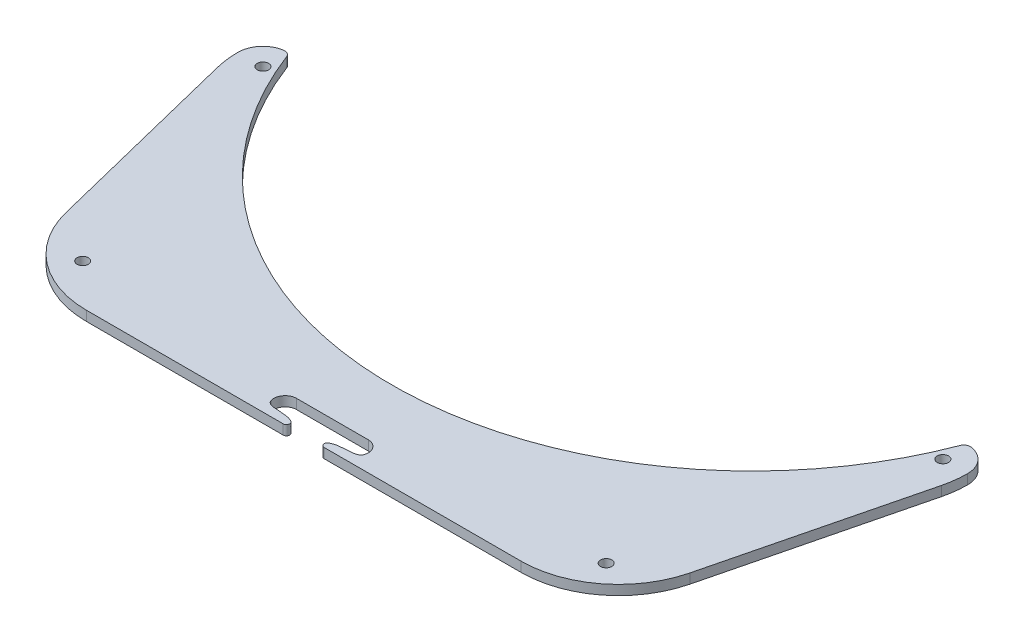
ISO-10303-21;
HEADER;
FILE_DESCRIPTION(('STEP AP214'),'2;1');
FILE_NAME('part.step','',(''),(''),'','','');
FILE_SCHEMA(('AUTOMOTIVE_DESIGN { 1 0 10303 214 1 1 1 1 }'));
ENDSEC;
DATA;
#1=APPLICATION_CONTEXT('core data for automotive mechanical design processes');
#2=APPLICATION_PROTOCOL_DEFINITION('international standard','automotive_design',2000,#1);
#3=PRODUCT_CONTEXT('',#1,'mechanical');
#4=PRODUCT('Part','Part','',(#3));
#5=PRODUCT_RELATED_PRODUCT_CATEGORY('part','',(#4));
#6=PRODUCT_DEFINITION_FORMATION('','',#4);
#7=PRODUCT_DEFINITION_CONTEXT('part definition',#1,'design');
#8=PRODUCT_DEFINITION('design','',#6,#7);
#9=PRODUCT_DEFINITION_SHAPE('','',#8);
#10=(LENGTH_UNIT() NAMED_UNIT(*) SI_UNIT(.MILLI.,.METRE.));
#11=(NAMED_UNIT(*) PLANE_ANGLE_UNIT() SI_UNIT($,.RADIAN.));
#12=(NAMED_UNIT(*) SI_UNIT($,.STERADIAN.) SOLID_ANGLE_UNIT());
#13=UNCERTAINTY_MEASURE_WITH_UNIT(LENGTH_MEASURE(1.E-05),#10,'distance_accuracy_value','');
#14=(GEOMETRIC_REPRESENTATION_CONTEXT(3) GLOBAL_UNCERTAINTY_ASSIGNED_CONTEXT((#13)) GLOBAL_UNIT_ASSIGNED_CONTEXT((#10,
#11,#12)) REPRESENTATION_CONTEXT('',''));
#15=CARTESIAN_POINT('',(0.,0.,0.));
#16=DIRECTION('',(0.,0.,1.));
#17=DIRECTION('',(1.,0.,0.));
#18=AXIS2_PLACEMENT_3D('',#15,#16,#17);
#19=CARTESIAN_POINT('',(0.,3.,29.3456606023015));
#20=DIRECTION('',(0.,0.,-1.));
#21=DIRECTION('',(-1.,0.,0.));
#22=AXIS2_PLACEMENT_3D('',#19,#20,#21);
#23=PLANE('',#22);
#24=DIRECTION('',(0.,1.,0.));
#25=VECTOR('',#24,1.);
#26=CARTESIAN_POINT('',(-6.29344842056771,-7.,29.3456606023015));
#27=LINE('',#26,#25);
#28=CARTESIAN_POINT('',(-6.29344842056771,0.,29.3456606023015));
#29=VERTEX_POINT('',#28);
#30=CARTESIAN_POINT('',(-6.29344842056771,3.,29.3456606023015));
#31=VERTEX_POINT('',#30);
#32=EDGE_CURVE('E52',#29,#31,#27,.T.);
#33=ORIENTED_EDGE('',*,*,#32,.T.);
#34=DIRECTION('',(1.,0.,0.));
#35=VECTOR('',#34,1.);
#36=CARTESIAN_POINT('',(0.,3.,29.3456606023015));
#37=LINE('',#36,#35);
#38=CARTESIAN_POINT('',(-66.7805914104085,3.,29.3456606023015));
#39=VERTEX_POINT('',#38);
#40=EDGE_CURVE('E119',#39,#31,#37,.T.);
#41=ORIENTED_EDGE('',*,*,#40,.F.);
#42=DIRECTION('',(0.,-1.,0.));
#43=VECTOR('',#42,1.);
#44=CARTESIAN_POINT('',(-66.7805914104085,3.,29.3456606023015));
#45=LINE('',#44,#43);
#46=CARTESIAN_POINT('',(-66.7805914104085,0.,29.3456606023015));
#47=VERTEX_POINT('',#46);
#48=EDGE_CURVE('E130',#39,#47,#45,.T.);
#49=ORIENTED_EDGE('',*,*,#48,.T.);
#50=DIRECTION('',(1.,0.,0.));
#51=VECTOR('',#50,1.);
#52=CARTESIAN_POINT('',(0.,0.,29.3456606023015));
#53=LINE('',#52,#51);
#54=EDGE_CURVE('E151',#47,#29,#53,.T.);
#55=ORIENTED_EDGE('',*,*,#54,.T.);
#56=EDGE_LOOP('',(#33,#41,#49,#55));
#57=FACE_BOUND('',#56,.T.);
#58=ADVANCED_FACE('F37',(#57),#23,.F.);
#59=CARTESIAN_POINT('',(0.,3.,0.));
#60=DIRECTION('',(0.,1.,0.));
#61=DIRECTION('',(0.,0.,1.));
#62=AXIS2_PLACEMENT_3D('',#59,#60,#61);
#63=PLANE('',#62);
#64=CARTESIAN_POINT('',(104.507530950677,3.,-62.6241657822366));
#65=DIRECTION('',(0.,1.,0.));
#66=DIRECTION('',(0.,0.,1.));
#67=AXIS2_PLACEMENT_3D('',#64,#65,#66);
#68=CIRCLE('',#67,1.75);
#69=CARTESIAN_POINT('',(104.507530950677,3.,-60.8741657822366));
#70=VERTEX_POINT('',#69);
#71=EDGE_CURVE('E173',#70,#70,#68,.T.);
#72=ORIENTED_EDGE('',*,*,#71,.F.);
#73=EDGE_LOOP('',(#72));
#74=FACE_BOUND('',#73,.T.);
#75=CARTESIAN_POINT('',(-80.4501847084653,3.,16.8189513065068));
#76=DIRECTION('',(0.,1.,0.));
#77=DIRECTION('',(0.,0.,1.));
#78=AXIS2_PLACEMENT_3D('',#75,#76,#77);
#79=CIRCLE('',#78,1.75);
#80=CARTESIAN_POINT('',(-80.4501847084653,3.,18.5689513065068));
#81=VERTEX_POINT('',#80);
#82=EDGE_CURVE('E248',#81,#81,#79,.T.);
#83=ORIENTED_EDGE('',*,*,#82,.F.);
#84=EDGE_LOOP('',(#83));
#85=FACE_BOUND('',#84,.T.);
#86=CARTESIAN_POINT('',(80.4501847084653,3.,16.8189513065068));
#87=DIRECTION('',(0.,1.,0.));
#88=DIRECTION('',(0.,0.,1.));
#89=AXIS2_PLACEMENT_3D('',#86,#87,#88);
#90=CIRCLE('',#89,1.75);
#91=CARTESIAN_POINT('',(80.4501847084653,3.,18.5689513065068));
#92=VERTEX_POINT('',#91);
#93=EDGE_CURVE('E245',#92,#92,#90,.T.);
#94=ORIENTED_EDGE('',*,*,#93,.F.);
#95=EDGE_LOOP('',(#94));
#96=FACE_BOUND('',#95,.T.);
#97=CARTESIAN_POINT('',(-104.507530950677,3.,-62.6241657822366));
#98=DIRECTION('',(0.,1.,0.));
#99=DIRECTION('',(0.,0.,1.));
#100=AXIS2_PLACEMENT_3D('',#97,#98,#99);
#101=CIRCLE('',#100,1.75);
#102=CARTESIAN_POINT('',(-104.507530950677,3.,-60.8741657822366));
#103=VERTEX_POINT('',#102);
#104=EDGE_CURVE('E178',#103,#103,#101,.T.);
#105=ORIENTED_EDGE('',*,*,#104,.F.);
#106=EDGE_LOOP('',(#105));
#107=FACE_BOUND('',#106,.T.);
#108=CARTESIAN_POINT('',(6.29344842056773,3.,28.3456606023015));
#109=DIRECTION('',(0.,-1.,0.));
#110=DIRECTION('',(0.,0.,1.));
#111=AXIS2_PLACEMENT_3D('',#108,#109,#110);
#112=CIRCLE('',#111,1.);
#113=CARTESIAN_POINT('',(6.29344842056773,3.,29.3456606023015));
#114=VERTEX_POINT('',#113);
#115=CARTESIAN_POINT('',(5.80457635502104,3.,27.4733051108142));
#116=VERTEX_POINT('',#115);
#117=EDGE_CURVE('E116',#114,#116,#112,.T.);
#118=ORIENTED_EDGE('',*,*,#117,.F.);
#119=CARTESIAN_POINT('',(66.7805914104085,3.,29.3456606023015));
#120=VERTEX_POINT('',#119);
#121=EDGE_CURVE('E108',#114,#120,#37,.T.);
#122=ORIENTED_EDGE('',*,*,#121,.T.);
#123=CARTESIAN_POINT('',(66.7805914104085,3.,-0.654339397698461));
#124=DIRECTION('',(0.,1.,0.));
#125=DIRECTION('',(0.,0.,1.));
#126=AXIS2_PLACEMENT_3D('',#123,#124,#125);
#127=CIRCLE('',#126,30.);
#128=CARTESIAN_POINT('',(95.8987006346659,3.,6.56616717761984));
#129=VERTEX_POINT('',#128);
#130=EDGE_CURVE('E112',#129,#120,#127,.F.);
#131=ORIENTED_EDGE('',*,*,#130,.F.);
#132=DIRECTION('',(0.24068355251061,0.,-0.970603640808581));
#133=VECTOR('',#132,1.);
#134=CARTESIAN_POINT('',(91.8773371714655,3.,22.783104220814));
#135=LINE('',#134,#133);
#136=CARTESIAN_POINT('',(111.265547961007,3.,-55.4036592069183));
#137=VERTEX_POINT('',#136);
#138=EDGE_CURVE('E61',#129,#137,#135,.T.);
#139=ORIENTED_EDGE('',*,*,#138,.T.);
#140=CARTESIAN_POINT('',(82.1474387367497,3.,-62.6241657822366));
#141=DIRECTION('',(0.,1.,0.));
#142=DIRECTION('',(0.,0.,1.));
#143=AXIS2_PLACEMENT_3D('',#140,#141,#142);
#144=CIRCLE('',#143,30.);
#145=CARTESIAN_POINT('',(112.14743873675,3.,-62.6241657822366));
#146=VERTEX_POINT('',#145);
#147=EDGE_CURVE('E135',#137,#146,#144,.T.);
#148=ORIENTED_EDGE('',*,*,#147,.T.);
#149=CARTESIAN_POINT('',(104.507530950677,3.,-62.6241657822366));
#150=DIRECTION('',(0.,1.,0.));
#151=DIRECTION('',(0.,0.,1.));
#152=AXIS2_PLACEMENT_3D('',#149,#150,#151);
#153=CIRCLE('',#152,7.63990778607275);
#154=CARTESIAN_POINT('',(105.671102633372,3.,-70.1749466636372));
#155=VERTEX_POINT('',#154);
#156=EDGE_CURVE('E261',#146,#155,#153,.T.);
#157=ORIENTED_EDGE('',*,*,#156,.T.);
#158=CARTESIAN_POINT('',(105.366499039906,3.,-68.1982785956887));
#159=DIRECTION('',(0.,1.,0.));
#160=DIRECTION('',(0.,0.,1.));
#161=AXIS2_PLACEMENT_3D('',#158,#159,#160);
#162=CIRCLE('',#161,2.);
#163=CARTESIAN_POINT('',(103.498491265345,3.,-68.9128042804483));
#164=VERTEX_POINT('',#163);
#165=EDGE_CURVE('E281',#155,#164,#162,.T.);
#166=ORIENTED_EDGE('',*,*,#165,.T.);
#167=CARTESIAN_POINT('',(0.,3.,-108.501681452203));
#168=DIRECTION('',(0.,1.,0.));
#169=DIRECTION('',(0.,0.,1.));
#170=AXIS2_PLACEMENT_3D('',#167,#168,#169);
#171=CIRCLE('',#170,110.811627954484);
#172=CARTESIAN_POINT('',(-103.498491265345,3.,-68.9128042804483));
#173=VERTEX_POINT('',#172);
#174=EDGE_CURVE('E145',#173,#164,#171,.T.);
#175=ORIENTED_EDGE('',*,*,#174,.F.);
#176=CARTESIAN_POINT('',(-105.366499039906,3.,-68.1982785956887));
#177=DIRECTION('',(0.,1.,0.));
#178=DIRECTION('',(0.,0.,-1.));
#179=AXIS2_PLACEMENT_3D('',#176,#177,#178);
#180=CIRCLE('',#179,2.);
#181=CARTESIAN_POINT('',(-105.671102633372,3.,-70.1749466636372));
#182=VERTEX_POINT('',#181);
#183=EDGE_CURVE('E263',#173,#182,#180,.T.);
#184=ORIENTED_EDGE('',*,*,#183,.T.);
#185=CARTESIAN_POINT('',(-104.507530950677,3.,-62.6241657822366));
#186=DIRECTION('',(0.,1.,0.));
#187=DIRECTION('',(0.,0.,-1.));
#188=AXIS2_PLACEMENT_3D('',#185,#186,#187);
#189=CIRCLE('',#188,7.63990778607275);
#190=CARTESIAN_POINT('',(-112.14743873675,3.,-62.6241657822366));
#191=VERTEX_POINT('',#190);
#192=EDGE_CURVE('E172',#182,#191,#189,.T.);
#193=ORIENTED_EDGE('',*,*,#192,.T.);
#194=CARTESIAN_POINT('',(-82.1474387367497,3.,-62.6241657822366));
#195=DIRECTION('',(0.,1.,0.));
#196=DIRECTION('',(0.,0.,1.));
#197=AXIS2_PLACEMENT_3D('',#194,#195,#196);
#198=CIRCLE('',#197,30.);
#199=CARTESIAN_POINT('',(-111.265547961007,3.,-55.4036592069183));
#200=VERTEX_POINT('',#199);
#201=EDGE_CURVE('E96',#191,#200,#198,.T.);
#202=ORIENTED_EDGE('',*,*,#201,.T.);
#203=DIRECTION('',(-0.24068355251061,0.,-0.970603640808581));
#204=VECTOR('',#203,1.);
#205=CARTESIAN_POINT('',(-91.8773371714655,3.,22.7831042208141));
#206=LINE('',#205,#204);
#207=CARTESIAN_POINT('',(-95.8987006346659,3.,6.56616717761984));
#208=VERTEX_POINT('',#207);
#209=EDGE_CURVE('E300',#208,#200,#206,.T.);
#210=ORIENTED_EDGE('',*,*,#209,.F.);
#211=CARTESIAN_POINT('',(-66.7805914104085,3.,-0.654339397698461));
#212=DIRECTION('',(0.,1.,0.));
#213=DIRECTION('',(0.,0.,1.));
#214=AXIS2_PLACEMENT_3D('',#211,#212,#213);
#215=CIRCLE('',#214,30.);
#216=EDGE_CURVE('E120',#39,#208,#215,.F.);
#217=ORIENTED_EDGE('',*,*,#216,.F.);
#218=ORIENTED_EDGE('',*,*,#40,.T.);
#219=CARTESIAN_POINT('',(-6.29344842056771,3.,28.3456606023015));
#220=DIRECTION('',(0.,-1.,0.));
#221=DIRECTION('',(0.,0.,1.));
#222=AXIS2_PLACEMENT_3D('',#219,#220,#221);
#223=CIRCLE('',#222,1.);
#224=CARTESIAN_POINT('',(-5.80457635502104,3.,27.4733051108142));
#225=VERTEX_POINT('',#224);
#226=EDGE_CURVE('E318',#225,#31,#223,.T.);
#227=ORIENTED_EDGE('',*,*,#226,.F.);
#228=CARTESIAN_POINT('',(-14.3784570925038,3.,24.9876745493891));
#229=CARTESIAN_POINT('',(-14.0506615471462,3.,26.1193369399275));
#230=CARTESIAN_POINT('',(-10.489346866623,3.,26.7600909903028));
#231=CARTESIAN_POINT('',(-7.72474957365098,3.,26.4937574664827));
#232=CARTESIAN_POINT('',(-5.90450881564876,3.,27.4173024961474));
#233=CARTESIAN_POINT('',(-5.80457635502104,3.,27.4733051108142));
#234=B_SPLINE_CURVE_WITH_KNOTS('',3,(#228,#229,#230,#231,#232,#233),.UNSPECIFIED.,.F.,.F.,(4,1,
1,4),(0.,0.27412385349263,0.745489655390744,0.777393607827548),.UNSPECIFIED.);
#235=CARTESIAN_POINT('',(-14.3784570925038,3.,24.9876745493891));
#236=VERTEX_POINT('',#235);
#237=EDGE_CURVE('E609',#236,#225,#234,.T.);
#238=ORIENTED_EDGE('',*,*,#237,.F.);
#239=CARTESIAN_POINT('',(-11.0166480970681,3.,24.0138982515634));
#240=DIRECTION('',(0.,1.,0.));
#241=DIRECTION('',(0.,0.,1.));
#242=AXIS2_PLACEMENT_3D('',#239,#240,#241);
#243=CIRCLE('',#242,3.5);
#244=CARTESIAN_POINT('',(-11.0166480970681,3.,20.5138982515634));
#245=VERTEX_POINT('',#244);
#246=EDGE_CURVE('E242',#245,#236,#243,.T.);
#247=ORIENTED_EDGE('',*,*,#246,.F.);
#248=DIRECTION('',(-1.,0.,0.));
#249=VECTOR('',#248,1.);
#250=CARTESIAN_POINT('',(11.0166480970681,3.,20.5138982515634));
#251=LINE('',#250,#249);
#252=CARTESIAN_POINT('',(11.0166480970681,3.,20.5138982515634));
#253=VERTEX_POINT('',#252);
#254=EDGE_CURVE('E632',#253,#245,#251,.T.);
#255=ORIENTED_EDGE('',*,*,#254,.F.);
#256=CARTESIAN_POINT('',(11.0166480970681,3.,24.0138982515634));
#257=DIRECTION('',(0.,1.,0.));
#258=DIRECTION('',(0.,0.,1.));
#259=AXIS2_PLACEMENT_3D('',#256,#257,#258);
#260=CIRCLE('',#259,3.5);
#261=CARTESIAN_POINT('',(14.3784570925038,3.,24.9876745493891));
#262=VERTEX_POINT('',#261);
#263=EDGE_CURVE('E626',#262,#253,#260,.T.);
#264=ORIENTED_EDGE('',*,*,#263,.F.);
#265=CARTESIAN_POINT('',(5.80457635502104,3.,27.4733051108142));
#266=CARTESIAN_POINT('',(5.90450881564877,3.,27.4173024961474));
#267=CARTESIAN_POINT('',(7.724749573651,3.,26.4937574664827));
#268=CARTESIAN_POINT('',(10.489346866623,3.,26.7600909903028));
#269=CARTESIAN_POINT('',(14.0506615471462,3.,26.1193369399275));
#270=CARTESIAN_POINT('',(14.3784570925038,3.,24.9876745493891));
#271=B_SPLINE_CURVE_WITH_KNOTS('',3,(#265,#266,#267,#268,#269,#270),.UNSPECIFIED.,.F.,.F.,(4,1,
1,4),(0.,0.0319039524368033,0.503269754334918,0.777393607827548),.UNSPECIFIED.);
#272=EDGE_CURVE('E622',#116,#262,#271,.T.);
#273=ORIENTED_EDGE('',*,*,#272,.F.);
#274=EDGE_LOOP('',(#118,#122,#131,#139,#148,#157,#166,#175,#184,#193,#202,#210,#217,#218,#227,
#238,#247,#255,#264,#273));
#275=FACE_BOUND('',#274,.T.);
#276=ADVANCED_FACE('F110',(#74,#85,#96,#107,#275),#63,.T.);
#277=CARTESIAN_POINT('',(0.,0.,0.));
#278=DIRECTION('',(0.,1.,0.));
#279=DIRECTION('',(0.,0.,1.));
#280=AXIS2_PLACEMENT_3D('',#277,#278,#279);
#281=PLANE('',#280);
#282=CARTESIAN_POINT('',(-104.507530950677,0.,-62.6241657822366));
#283=DIRECTION('',(0.,1.,0.));
#284=DIRECTION('',(0.,0.,1.));
#285=AXIS2_PLACEMENT_3D('',#282,#283,#284);
#286=CIRCLE('',#285,1.75);
#287=CARTESIAN_POINT('',(-104.507530950677,0.,-60.8741657822366));
#288=VERTEX_POINT('',#287);
#289=EDGE_CURVE('E181',#288,#288,#286,.T.);
#290=ORIENTED_EDGE('',*,*,#289,.T.);
#291=EDGE_LOOP('',(#290));
#292=FACE_BOUND('',#291,.T.);
#293=CARTESIAN_POINT('',(80.4501847084653,0.,16.8189513065068));
#294=DIRECTION('',(0.,1.,0.));
#295=DIRECTION('',(0.,0.,1.));
#296=AXIS2_PLACEMENT_3D('',#293,#294,#295);
#297=CIRCLE('',#296,1.75);
#298=CARTESIAN_POINT('',(80.4501847084653,0.,18.5689513065068));
#299=VERTEX_POINT('',#298);
#300=EDGE_CURVE('E177',#299,#299,#297,.T.);
#301=ORIENTED_EDGE('',*,*,#300,.T.);
#302=EDGE_LOOP('',(#301));
#303=FACE_BOUND('',#302,.T.);
#304=CARTESIAN_POINT('',(-80.4501847084653,0.,16.8189513065068));
#305=DIRECTION('',(0.,1.,0.));
#306=DIRECTION('',(0.,0.,1.));
#307=AXIS2_PLACEMENT_3D('',#304,#305,#306);
#308=CIRCLE('',#307,1.75);
#309=CARTESIAN_POINT('',(-80.4501847084653,0.,18.5689513065068));
#310=VERTEX_POINT('',#309);
#311=EDGE_CURVE('E174',#310,#310,#308,.T.);
#312=ORIENTED_EDGE('',*,*,#311,.T.);
#313=EDGE_LOOP('',(#312));
#314=FACE_BOUND('',#313,.T.);
#315=CARTESIAN_POINT('',(104.507530950677,0.,-62.6241657822366));
#316=DIRECTION('',(0.,1.,0.));
#317=DIRECTION('',(0.,0.,1.));
#318=AXIS2_PLACEMENT_3D('',#315,#316,#317);
#319=CIRCLE('',#318,1.75);
#320=CARTESIAN_POINT('',(104.507530950677,0.,-60.8741657822366));
#321=VERTEX_POINT('',#320);
#322=EDGE_CURVE('E169',#321,#321,#319,.T.);
#323=ORIENTED_EDGE('',*,*,#322,.T.);
#324=EDGE_LOOP('',(#323));
#325=FACE_BOUND('',#324,.T.);
#326=CARTESIAN_POINT('',(6.29344842056773,0.,29.3456606023015));
#327=VERTEX_POINT('',#326);
#328=CARTESIAN_POINT('',(66.7805914104085,0.,29.3456606023015));
#329=VERTEX_POINT('',#328);
#330=EDGE_CURVE('E126',#327,#329,#53,.T.);
#331=ORIENTED_EDGE('',*,*,#330,.F.);
#332=CARTESIAN_POINT('',(6.29344842056773,0.,28.3456606023015));
#333=DIRECTION('',(0.,1.,0.));
#334=DIRECTION('',(0.,0.,1.));
#335=AXIS2_PLACEMENT_3D('',#332,#333,#334);
#336=CIRCLE('',#335,1.);
#337=CARTESIAN_POINT('',(5.80457635502104,0.,27.4733051108142));
#338=VERTEX_POINT('',#337);
#339=EDGE_CURVE('E11',#327,#338,#336,.F.);
#340=ORIENTED_EDGE('',*,*,#339,.T.);
#341=CARTESIAN_POINT('',(5.80457635502104,0.,27.4733051108142));
#342=CARTESIAN_POINT('',(5.90450881564877,0.,27.4173024961474));
#343=CARTESIAN_POINT('',(7.724749573651,0.,26.4937574664827));
#344=CARTESIAN_POINT('',(10.489346866623,0.,26.7600909903028));
#345=CARTESIAN_POINT('',(14.0506615471462,0.,26.1193369399275));
#346=CARTESIAN_POINT('',(14.3784570925038,0.,24.9876745493891));
#347=B_SPLINE_CURVE_WITH_KNOTS('',3,(#341,#342,#343,#344,#345,#346),.UNSPECIFIED.,.F.,.F.,(4,1,
1,4),(0.,0.0319039524368033,0.503269754334918,0.777393607827548),.UNSPECIFIED.);
#348=CARTESIAN_POINT('',(14.3784570925038,0.,24.9876745493891));
#349=VERTEX_POINT('',#348);
#350=EDGE_CURVE('E45',#338,#349,#347,.T.);
#351=ORIENTED_EDGE('',*,*,#350,.T.);
#352=CARTESIAN_POINT('',(11.0166480970681,0.,24.0138982515634));
#353=DIRECTION('',(0.,1.,0.));
#354=DIRECTION('',(0.,0.,1.));
#355=AXIS2_PLACEMENT_3D('',#352,#353,#354);
#356=CIRCLE('',#355,3.5);
#357=CARTESIAN_POINT('',(11.0166480970681,0.,20.5138982515634));
#358=VERTEX_POINT('',#357);
#359=EDGE_CURVE('E199',#349,#358,#356,.T.);
#360=ORIENTED_EDGE('',*,*,#359,.T.);
#361=DIRECTION('',(-1.,0.,0.));
#362=VECTOR('',#361,1.);
#363=CARTESIAN_POINT('',(0.,0.,20.5138982515634));
#364=LINE('',#363,#362);
#365=CARTESIAN_POINT('',(-11.0166480970681,0.,20.5138982515634));
#366=VERTEX_POINT('',#365);
#367=EDGE_CURVE('E196',#358,#366,#364,.T.);
#368=ORIENTED_EDGE('',*,*,#367,.T.);
#369=CARTESIAN_POINT('',(-11.0166480970681,0.,24.0138982515634));
#370=DIRECTION('',(0.,1.,0.));
#371=DIRECTION('',(0.,0.,1.));
#372=AXIS2_PLACEMENT_3D('',#369,#370,#371);
#373=CIRCLE('',#372,3.5);
#374=CARTESIAN_POINT('',(-14.3784570925038,0.,24.9876745493891));
#375=VERTEX_POINT('',#374);
#376=EDGE_CURVE('E190',#366,#375,#373,.T.);
#377=ORIENTED_EDGE('',*,*,#376,.T.);
#378=CARTESIAN_POINT('',(-14.3784570925038,0.,24.9876745493891));
#379=CARTESIAN_POINT('',(-14.0506615471462,0.,26.1193369399275));
#380=CARTESIAN_POINT('',(-10.489346866623,0.,26.7600909903028));
#381=CARTESIAN_POINT('',(-7.72474957365098,0.,26.4937574664827));
#382=CARTESIAN_POINT('',(-5.90450881564876,0.,27.4173024961474));
#383=CARTESIAN_POINT('',(-5.80457635502104,0.,27.4733051108142));
#384=B_SPLINE_CURVE_WITH_KNOTS('',3,(#378,#379,#380,#381,#382,#383),.UNSPECIFIED.,.F.,.F.,(4,1,
1,4),(0.,0.27412385349263,0.745489655390744,0.777393607827548),.UNSPECIFIED.);
#385=CARTESIAN_POINT('',(-5.80457635502104,0.,27.4733051108142));
#386=VERTEX_POINT('',#385);
#387=EDGE_CURVE('E185',#375,#386,#384,.T.);
#388=ORIENTED_EDGE('',*,*,#387,.T.);
#389=CARTESIAN_POINT('',(-6.29344842056771,0.,28.3456606023015));
#390=DIRECTION('',(0.,1.,0.));
#391=DIRECTION('',(0.,0.,1.));
#392=AXIS2_PLACEMENT_3D('',#389,#390,#391);
#393=CIRCLE('',#392,1.);
#394=EDGE_CURVE('E168',#386,#29,#393,.F.);
#395=ORIENTED_EDGE('',*,*,#394,.T.);
#396=ORIENTED_EDGE('',*,*,#54,.F.);
#397=CARTESIAN_POINT('',(-66.7805914104085,0.,-0.654339397698461));
#398=DIRECTION('',(0.,1.,0.));
#399=DIRECTION('',(0.,0.,1.));
#400=AXIS2_PLACEMENT_3D('',#397,#398,#399);
#401=CIRCLE('',#400,30.);
#402=CARTESIAN_POINT('',(-95.8987006346659,0.,6.56616717761984));
#403=VERTEX_POINT('',#402);
#404=EDGE_CURVE('E148',#47,#403,#401,.F.);
#405=ORIENTED_EDGE('',*,*,#404,.T.);
#406=DIRECTION('',(-0.24068355251061,0.,-0.970603640808581));
#407=VECTOR('',#406,1.);
#408=CARTESIAN_POINT('',(-91.8773371714655,0.,22.7831042208141));
#409=LINE('',#408,#407);
#410=CARTESIAN_POINT('',(-111.265547961007,0.,-55.4036592069183));
#411=VERTEX_POINT('',#410);
#412=EDGE_CURVE('E144',#403,#411,#409,.T.);
#413=ORIENTED_EDGE('',*,*,#412,.T.);
#414=CARTESIAN_POINT('',(-82.1474387367497,0.,-62.6241657822366));
#415=DIRECTION('',(0.,1.,0.));
#416=DIRECTION('',(0.,0.,1.));
#417=AXIS2_PLACEMENT_3D('',#414,#415,#416);
#418=CIRCLE('',#417,30.);
#419=CARTESIAN_POINT('',(-112.14743873675,0.,-62.6241657822366));
#420=VERTEX_POINT('',#419);
#421=EDGE_CURVE('E142',#420,#411,#418,.T.);
#422=ORIENTED_EDGE('',*,*,#421,.F.);
#423=CARTESIAN_POINT('',(-104.507530950677,0.,-62.6241657822366));
#424=DIRECTION('',(0.,1.,0.));
#425=DIRECTION('',(0.,0.,1.));
#426=AXIS2_PLACEMENT_3D('',#423,#424,#425);
#427=CIRCLE('',#426,7.63990778607275);
#428=CARTESIAN_POINT('',(-105.671102633372,0.,-70.1749466636372));
#429=VERTEX_POINT('',#428);
#430=EDGE_CURVE('E257',#420,#429,#427,.F.);
#431=ORIENTED_EDGE('',*,*,#430,.T.);
#432=CARTESIAN_POINT('',(-105.366499039906,0.,-68.1982785956887));
#433=DIRECTION('',(0.,1.,0.));
#434=DIRECTION('',(0.,0.,1.));
#435=AXIS2_PLACEMENT_3D('',#432,#433,#434);
#436=CIRCLE('',#435,2.);
#437=CARTESIAN_POINT('',(-103.498491265345,0.,-68.9128042804483));
#438=VERTEX_POINT('',#437);
#439=EDGE_CURVE('E254',#429,#438,#436,.F.);
#440=ORIENTED_EDGE('',*,*,#439,.T.);
#441=CARTESIAN_POINT('',(0.,0.,-108.501681452203));
#442=DIRECTION('',(0.,-1.,0.));
#443=DIRECTION('',(0.,0.,-1.));
#444=AXIS2_PLACEMENT_3D('',#441,#442,#443);
#445=CIRCLE('',#444,110.811627954484);
#446=CARTESIAN_POINT('',(103.498491265345,0.,-68.9128042804483));
#447=VERTEX_POINT('',#446);
#448=EDGE_CURVE('E294',#447,#438,#445,.T.);
#449=ORIENTED_EDGE('',*,*,#448,.F.);
#450=CARTESIAN_POINT('',(105.366499039906,0.,-68.1982785956887));
#451=DIRECTION('',(0.,1.,0.));
#452=DIRECTION('',(0.,0.,1.));
#453=AXIS2_PLACEMENT_3D('',#450,#451,#452);
#454=CIRCLE('',#453,2.);
#455=CARTESIAN_POINT('',(105.671102633372,0.,-70.1749466636372));
#456=VERTEX_POINT('',#455);
#457=EDGE_CURVE('E274',#447,#456,#454,.F.);
#458=ORIENTED_EDGE('',*,*,#457,.T.);
#459=CARTESIAN_POINT('',(104.507530950677,0.,-62.6241657822366));
#460=DIRECTION('',(0.,1.,0.));
#461=DIRECTION('',(0.,0.,1.));
#462=AXIS2_PLACEMENT_3D('',#459,#460,#461);
#463=CIRCLE('',#462,7.63990778607275);
#464=CARTESIAN_POINT('',(112.14743873675,0.,-62.6241657822366));
#465=VERTEX_POINT('',#464);
#466=EDGE_CURVE('E277',#456,#465,#463,.F.);
#467=ORIENTED_EDGE('',*,*,#466,.T.);
#468=CARTESIAN_POINT('',(82.1474387367497,0.,-62.6241657822366));
#469=DIRECTION('',(0.,1.,0.));
#470=DIRECTION('',(0.,0.,1.));
#471=AXIS2_PLACEMENT_3D('',#468,#469,#470);
#472=CIRCLE('',#471,30.);
#473=CARTESIAN_POINT('',(111.265547961007,0.,-55.4036592069183));
#474=VERTEX_POINT('',#473);
#475=EDGE_CURVE('E157',#474,#465,#472,.T.);
#476=ORIENTED_EDGE('',*,*,#475,.F.);
#477=DIRECTION('',(0.24068355251061,0.,-0.970603640808581));
#478=VECTOR('',#477,1.);
#479=CARTESIAN_POINT('',(91.8773371714655,0.,22.783104220814));
#480=LINE('',#479,#478);
#481=CARTESIAN_POINT('',(95.8987006346659,0.,6.56616717761984));
#482=VERTEX_POINT('',#481);
#483=EDGE_CURVE('E88',#482,#474,#480,.T.);
#484=ORIENTED_EDGE('',*,*,#483,.F.);
#485=CARTESIAN_POINT('',(66.7805914104085,0.,-0.654339397698461));
#486=DIRECTION('',(0.,1.,0.));
#487=DIRECTION('',(0.,0.,1.));
#488=AXIS2_PLACEMENT_3D('',#485,#486,#487);
#489=CIRCLE('',#488,30.);
#490=EDGE_CURVE('E154',#482,#329,#489,.F.);
#491=ORIENTED_EDGE('',*,*,#490,.T.);
#492=EDGE_LOOP('',(#331,#340,#351,#360,#368,#377,#388,#395,#396,#405,#413,#422,#431,#440,#449,
#458,#467,#476,#484,#491));
#493=FACE_BOUND('',#492,.T.);
#494=ADVANCED_FACE('F210',(#292,#303,#314,#325,#493),#281,.F.);
#495=CARTESIAN_POINT('',(-82.1474387367497,3.,-62.6241657822366));
#496=DIRECTION('',(0.,-1.,0.));
#497=DIRECTION('',(0.,0.,-1.));
#498=AXIS2_PLACEMENT_3D('',#495,#496,#497);
#499=CYLINDRICAL_SURFACE('',#498,30.);
#500=ORIENTED_EDGE('',*,*,#201,.F.);
#501=DIRECTION('',(0.,1.,0.));
#502=VECTOR('',#501,1.);
#503=CARTESIAN_POINT('',(-112.14743873675,-21.4153801679,-62.6241657822366));
#504=LINE('',#503,#502);
#505=EDGE_CURVE('E266',#420,#191,#504,.T.);
#506=ORIENTED_EDGE('',*,*,#505,.F.);
#507=ORIENTED_EDGE('',*,*,#421,.T.);
#508=DIRECTION('',(0.,-1.,0.));
#509=VECTOR('',#508,1.);
#510=CARTESIAN_POINT('',(-111.265547961007,3.,-55.4036592069183));
#511=LINE('',#510,#509);
#512=EDGE_CURVE('E165',#200,#411,#511,.T.);
#513=ORIENTED_EDGE('',*,*,#512,.F.);
#514=EDGE_LOOP('',(#500,#506,#507,#513));
#515=FACE_BOUND('',#514,.T.);
#516=ADVANCED_FACE('F39',(#515),#499,.T.);
#517=CARTESIAN_POINT('',(-91.8773371714655,3.,22.7831042208141));
#518=DIRECTION('',(-0.970603640808581,0.,0.24068355251061));
#519=DIRECTION('',(0.24068355251061,0.,0.970603640808581));
#520=AXIS2_PLACEMENT_3D('',#517,#518,#519);
#521=PLANE('',#520);
#522=ORIENTED_EDGE('',*,*,#412,.F.);
#523=DIRECTION('',(0.,-1.,0.));
#524=VECTOR('',#523,1.);
#525=CARTESIAN_POINT('',(-95.8987006346659,3.,6.56616717761984));
#526=LINE('',#525,#524);
#527=EDGE_CURVE('E163',#208,#403,#526,.T.);
#528=ORIENTED_EDGE('',*,*,#527,.F.);
#529=ORIENTED_EDGE('',*,*,#209,.T.);
#530=ORIENTED_EDGE('',*,*,#512,.T.);
#531=EDGE_LOOP('',(#522,#528,#529,#530));
#532=FACE_BOUND('',#531,.T.);
#533=ADVANCED_FACE('F312',(#532),#521,.T.);
#534=CARTESIAN_POINT('',(-66.7805914104085,3.,-0.654339397698461));
#535=DIRECTION('',(0.,-1.,0.));
#536=DIRECTION('',(0.,0.,-1.));
#537=AXIS2_PLACEMENT_3D('',#534,#535,#536);
#538=CYLINDRICAL_SURFACE('',#537,30.);
#539=ORIENTED_EDGE('',*,*,#404,.F.);
#540=ORIENTED_EDGE('',*,*,#48,.F.);
#541=ORIENTED_EDGE('',*,*,#216,.T.);
#542=ORIENTED_EDGE('',*,*,#527,.T.);
#543=EDGE_LOOP('',(#539,#540,#541,#542));
#544=FACE_BOUND('',#543,.T.);
#545=ADVANCED_FACE('F306',(#544),#538,.T.);
#546=ORIENTED_EDGE('',*,*,#121,.F.);
#547=DIRECTION('',(0.,1.,0.));
#548=VECTOR('',#547,1.);
#549=CARTESIAN_POINT('',(6.29344842056773,-7.,29.3456606023015));
#550=LINE('',#549,#548);
#551=EDGE_CURVE('E231',#327,#114,#550,.T.);
#552=ORIENTED_EDGE('',*,*,#551,.F.);
#553=ORIENTED_EDGE('',*,*,#330,.T.);
#554=DIRECTION('',(0.,-1.,0.));
#555=VECTOR('',#554,1.);
#556=CARTESIAN_POINT('',(66.7805914104085,3.,29.3456606023015));
#557=LINE('',#556,#555);
#558=EDGE_CURVE('E123',#120,#329,#557,.T.);
#559=ORIENTED_EDGE('',*,*,#558,.F.);
#560=EDGE_LOOP('',(#546,#552,#553,#559));
#561=FACE_BOUND('',#560,.T.);
#562=ADVANCED_FACE('F124',(#561),#23,.F.);
#563=CARTESIAN_POINT('',(66.7805914104085,3.,-0.654339397698461));
#564=DIRECTION('',(0.,-1.,0.));
#565=DIRECTION('',(0.,0.,-1.));
#566=AXIS2_PLACEMENT_3D('',#563,#564,#565);
#567=CYLINDRICAL_SURFACE('',#566,30.);
#568=ORIENTED_EDGE('',*,*,#490,.F.);
#569=DIRECTION('',(0.,-1.,0.));
#570=VECTOR('',#569,1.);
#571=CARTESIAN_POINT('',(95.8987006346659,3.,6.56616717761984));
#572=LINE('',#571,#570);
#573=EDGE_CURVE('E131',#129,#482,#572,.T.);
#574=ORIENTED_EDGE('',*,*,#573,.F.);
#575=ORIENTED_EDGE('',*,*,#130,.T.);
#576=ORIENTED_EDGE('',*,*,#558,.T.);
#577=EDGE_LOOP('',(#568,#574,#575,#576));
#578=FACE_BOUND('',#577,.T.);
#579=ADVANCED_FACE('F133',(#578),#567,.T.);
#580=CARTESIAN_POINT('',(91.8773371714655,3.,22.783104220814));
#581=DIRECTION('',(-0.970603640808581,0.,-0.24068355251061));
#582=DIRECTION('',(-0.24068355251061,0.,0.970603640808581));
#583=AXIS2_PLACEMENT_3D('',#580,#581,#582);
#584=PLANE('',#583);
#585=ORIENTED_EDGE('',*,*,#483,.T.);
#586=DIRECTION('',(0.,-1.,0.));
#587=VECTOR('',#586,1.);
#588=CARTESIAN_POINT('',(111.265547961007,3.,-55.4036592069183));
#589=LINE('',#588,#587);
#590=EDGE_CURVE('E141',#137,#474,#589,.T.);
#591=ORIENTED_EDGE('',*,*,#590,.F.);
#592=ORIENTED_EDGE('',*,*,#138,.F.);
#593=ORIENTED_EDGE('',*,*,#573,.T.);
#594=EDGE_LOOP('',(#585,#591,#592,#593));
#595=FACE_BOUND('',#594,.T.);
#596=ADVANCED_FACE('F387',(#595),#584,.F.);
#597=CARTESIAN_POINT('',(82.1474387367497,3.,-62.6241657822366));
#598=DIRECTION('',(0.,-1.,0.));
#599=DIRECTION('',(0.,0.,-1.));
#600=AXIS2_PLACEMENT_3D('',#597,#598,#599);
#601=CYLINDRICAL_SURFACE('',#600,30.);
#602=ORIENTED_EDGE('',*,*,#475,.T.);
#603=DIRECTION('',(0.,1.,0.));
#604=VECTOR('',#603,1.);
#605=CARTESIAN_POINT('',(112.14743873675,-21.4153801679,-62.6241657822366));
#606=LINE('',#605,#604);
#607=EDGE_CURVE('E284',#465,#146,#606,.T.);
#608=ORIENTED_EDGE('',*,*,#607,.T.);
#609=ORIENTED_EDGE('',*,*,#147,.F.);
#610=ORIENTED_EDGE('',*,*,#590,.T.);
#611=EDGE_LOOP('',(#602,#608,#609,#610));
#612=FACE_BOUND('',#611,.T.);
#613=ADVANCED_FACE('F386',(#612),#601,.T.);
#614=CARTESIAN_POINT('',(0.,10.,-108.501681452203));
#615=DIRECTION('',(0.,-1.,0.));
#616=DIRECTION('',(0.,0.,-1.));
#617=AXIS2_PLACEMENT_3D('',#614,#615,#616);
#618=CYLINDRICAL_SURFACE('',#617,110.811627954484);
#619=ORIENTED_EDGE('',*,*,#448,.T.);
#620=DIRECTION('',(0.,1.,0.));
#621=VECTOR('',#620,1.);
#622=CARTESIAN_POINT('',(-103.498491265345,-21.4153801679,-68.9128042804483));
#623=LINE('',#622,#621);
#624=EDGE_CURVE('E269',#438,#173,#623,.T.);
#625=ORIENTED_EDGE('',*,*,#624,.T.);
#626=ORIENTED_EDGE('',*,*,#174,.T.);
#627=DIRECTION('',(0.,1.,0.));
#628=VECTOR('',#627,1.);
#629=CARTESIAN_POINT('',(103.498491265345,-21.4153801679,-68.9128042804483));
#630=LINE('',#629,#628);
#631=EDGE_CURVE('E278',#447,#164,#630,.T.);
#632=ORIENTED_EDGE('',*,*,#631,.F.);
#633=EDGE_LOOP('',(#619,#625,#626,#632));
#634=FACE_BOUND('',#633,.T.);
#635=ADVANCED_FACE('F379',(#634),#618,.F.);
#636=CARTESIAN_POINT('',(105.366499039906,-21.4153801679,-68.1982785956887));
#637=DIRECTION('',(0.,1.,0.));
#638=DIRECTION('',(0.,0.,1.));
#639=AXIS2_PLACEMENT_3D('',#636,#637,#638);
#640=CYLINDRICAL_SURFACE('',#639,2.);
#641=ORIENTED_EDGE('',*,*,#457,.F.);
#642=ORIENTED_EDGE('',*,*,#631,.T.);
#643=ORIENTED_EDGE('',*,*,#165,.F.);
#644=DIRECTION('',(0.,1.,0.));
#645=VECTOR('',#644,1.);
#646=CARTESIAN_POINT('',(105.671102633372,-21.4153801679,-70.1749466636372));
#647=LINE('',#646,#645);
#648=EDGE_CURVE('E287',#456,#155,#647,.T.);
#649=ORIENTED_EDGE('',*,*,#648,.F.);
#650=EDGE_LOOP('',(#641,#642,#643,#649));
#651=FACE_BOUND('',#650,.T.);
#652=ADVANCED_FACE('F376',(#651),#640,.T.);
#653=CARTESIAN_POINT('',(104.507530950677,-21.4153801679,-62.6241657822366));
#654=DIRECTION('',(0.,1.,0.));
#655=DIRECTION('',(0.,0.,1.));
#656=AXIS2_PLACEMENT_3D('',#653,#654,#655);
#657=CYLINDRICAL_SURFACE('',#656,7.63990778607275);
#658=ORIENTED_EDGE('',*,*,#466,.F.);
#659=ORIENTED_EDGE('',*,*,#648,.T.);
#660=ORIENTED_EDGE('',*,*,#156,.F.);
#661=ORIENTED_EDGE('',*,*,#607,.F.);
#662=EDGE_LOOP('',(#658,#659,#660,#661));
#663=FACE_BOUND('',#662,.T.);
#664=ADVANCED_FACE('F385',(#663),#657,.T.);
#665=CARTESIAN_POINT('',(-104.507530950677,-21.4153801679,-62.6241657822366));
#666=DIRECTION('',(0.,1.,0.));
#667=DIRECTION('',(0.,0.,1.));
#668=AXIS2_PLACEMENT_3D('',#665,#666,#667);
#669=CYLINDRICAL_SURFACE('',#668,7.63990778607275);
#670=ORIENTED_EDGE('',*,*,#430,.F.);
#671=ORIENTED_EDGE('',*,*,#505,.T.);
#672=ORIENTED_EDGE('',*,*,#192,.F.);
#673=DIRECTION('',(0.,1.,0.));
#674=VECTOR('',#673,1.);
#675=CARTESIAN_POINT('',(-105.671102633372,-21.4153801679,-70.1749466636372));
#676=LINE('',#675,#674);
#677=EDGE_CURVE('E258',#429,#182,#676,.T.);
#678=ORIENTED_EDGE('',*,*,#677,.F.);
#679=EDGE_LOOP('',(#670,#671,#672,#678));
#680=FACE_BOUND('',#679,.T.);
#681=ADVANCED_FACE('F429',(#680),#669,.T.);
#682=CARTESIAN_POINT('',(-105.366499039906,-21.4153801679,-68.1982785956887));
#683=DIRECTION('',(0.,1.,0.));
#684=DIRECTION('',(0.,0.,1.));
#685=AXIS2_PLACEMENT_3D('',#682,#683,#684);
#686=CYLINDRICAL_SURFACE('',#685,2.);
#687=ORIENTED_EDGE('',*,*,#439,.F.);
#688=ORIENTED_EDGE('',*,*,#677,.T.);
#689=ORIENTED_EDGE('',*,*,#183,.F.);
#690=ORIENTED_EDGE('',*,*,#624,.F.);
#691=EDGE_LOOP('',(#687,#688,#689,#690));
#692=FACE_BOUND('',#691,.T.);
#693=ADVANCED_FACE('F432',(#692),#686,.T.);
#694=CARTESIAN_POINT('',(104.507530950677,-7.,-62.6241657822366));
#695=DIRECTION('',(0.,1.,0.));
#696=DIRECTION('',(0.,0.,1.));
#697=AXIS2_PLACEMENT_3D('',#694,#695,#696);
#698=CYLINDRICAL_SURFACE('',#697,1.75);
#699=ORIENTED_EDGE('',*,*,#71,.T.);
#700=EDGE_LOOP('',(#699));
#701=FACE_BOUND('',#700,.T.);
#702=ORIENTED_EDGE('',*,*,#322,.F.);
#703=EDGE_LOOP('',(#702));
#704=FACE_BOUND('',#703,.T.);
#705=ADVANCED_FACE('F434',(#701,#704),#698,.F.);
#706=CARTESIAN_POINT('',(-80.4501847084653,-7.,16.8189513065068));
#707=DIRECTION('',(0.,1.,0.));
#708=DIRECTION('',(0.,0.,1.));
#709=AXIS2_PLACEMENT_3D('',#706,#707,#708);
#710=CYLINDRICAL_SURFACE('',#709,1.75);
#711=ORIENTED_EDGE('',*,*,#82,.T.);
#712=EDGE_LOOP('',(#711));
#713=FACE_BOUND('',#712,.T.);
#714=ORIENTED_EDGE('',*,*,#311,.F.);
#715=EDGE_LOOP('',(#714));
#716=FACE_BOUND('',#715,.T.);
#717=ADVANCED_FACE('F440',(#713,#716),#710,.F.);
#718=CARTESIAN_POINT('',(80.4501847084653,-7.,16.8189513065068));
#719=DIRECTION('',(0.,1.,0.));
#720=DIRECTION('',(0.,0.,1.));
#721=AXIS2_PLACEMENT_3D('',#718,#719,#720);
#722=CYLINDRICAL_SURFACE('',#721,1.75);
#723=ORIENTED_EDGE('',*,*,#93,.T.);
#724=EDGE_LOOP('',(#723));
#725=FACE_BOUND('',#724,.T.);
#726=ORIENTED_EDGE('',*,*,#300,.F.);
#727=EDGE_LOOP('',(#726));
#728=FACE_BOUND('',#727,.T.);
#729=ADVANCED_FACE('F486',(#725,#728),#722,.F.);
#730=CARTESIAN_POINT('',(-104.507530950677,-7.,-62.6241657822366));
#731=DIRECTION('',(0.,1.,0.));
#732=DIRECTION('',(0.,0.,1.));
#733=AXIS2_PLACEMENT_3D('',#730,#731,#732);
#734=CYLINDRICAL_SURFACE('',#733,1.75);
#735=ORIENTED_EDGE('',*,*,#104,.T.);
#736=EDGE_LOOP('',(#735));
#737=FACE_BOUND('',#736,.T.);
#738=ORIENTED_EDGE('',*,*,#289,.F.);
#739=EDGE_LOOP('',(#738));
#740=FACE_BOUND('',#739,.T.);
#741=ADVANCED_FACE('F494',(#737,#740),#734,.F.);
#742=CARTESIAN_POINT('',(-14.3784570925038,-7.,24.9876745493891));
#743=CARTESIAN_POINT('',(-14.0506615471462,-7.,26.1193369399275));
#744=CARTESIAN_POINT('',(-10.489346866623,-7.,26.7600909903028));
#745=CARTESIAN_POINT('',(-7.72474957365098,-7.,26.4937574664827));
#746=CARTESIAN_POINT('',(-5.90450881564876,-7.,27.4173024961474));
#747=CARTESIAN_POINT('',(-5.80457635502104,-7.,27.4733051108142));
#748=B_SPLINE_CURVE_WITH_KNOTS('',3,(#742,#743,#744,#745,#746,#747),.UNSPECIFIED.,.F.,.F.,(4,1,
1,4),(0.,0.27412385349263,0.745489655390744,0.777393607827548),.UNSPECIFIED.);
#749=DIRECTION('',(0.,1.,0.));
#750=VECTOR('',#749,1.);
#751=SURFACE_OF_LINEAR_EXTRUSION('',#748,#750);
#752=DIRECTION('',(0.,1.,0.));
#753=VECTOR('',#752,1.);
#754=CARTESIAN_POINT('',(-14.3784570925038,-7.,24.9876745493891));
#755=LINE('',#754,#753);
#756=EDGE_CURVE('E251',#375,#236,#755,.T.);
#757=ORIENTED_EDGE('',*,*,#756,.T.);
#758=ORIENTED_EDGE('',*,*,#237,.T.);
#759=DIRECTION('',(0.,1.,0.));
#760=VECTOR('',#759,1.);
#761=CARTESIAN_POINT('',(-5.80457635502104,-7.,27.4733051108142));
#762=LINE('',#761,#760);
#763=EDGE_CURVE('E239',#386,#225,#762,.T.);
#764=ORIENTED_EDGE('',*,*,#763,.F.);
#765=ORIENTED_EDGE('',*,*,#387,.F.);
#766=EDGE_LOOP('',(#757,#758,#764,#765));
#767=FACE_BOUND('',#766,.T.);
#768=ADVANCED_FACE('F503',(#767),#751,.F.);
#769=CARTESIAN_POINT('',(-11.0166480970681,-7.,24.0138982515634));
#770=DIRECTION('',(0.,1.,0.));
#771=DIRECTION('',(0.,0.,1.));
#772=AXIS2_PLACEMENT_3D('',#769,#770,#771);
#773=CYLINDRICAL_SURFACE('',#772,3.5);
#774=DIRECTION('',(0.,1.,0.));
#775=VECTOR('',#774,1.);
#776=CARTESIAN_POINT('',(-11.0166480970681,-7.,20.5138982515634));
#777=LINE('',#776,#775);
#778=EDGE_CURVE('E638',#366,#245,#777,.T.);
#779=ORIENTED_EDGE('',*,*,#778,.T.);
#780=ORIENTED_EDGE('',*,*,#246,.T.);
#781=ORIENTED_EDGE('',*,*,#756,.F.);
#782=ORIENTED_EDGE('',*,*,#376,.F.);
#783=EDGE_LOOP('',(#779,#780,#781,#782));
#784=FACE_BOUND('',#783,.T.);
#785=ADVANCED_FACE('F513',(#784),#773,.F.);
#786=CARTESIAN_POINT('',(11.0166480970681,-7.,20.5138982515634));
#787=DIRECTION('',(0.,0.,-1.));
#788=DIRECTION('',(-1.,0.,0.));
#789=AXIS2_PLACEMENT_3D('',#786,#787,#788);
#790=PLANE('',#789);
#791=DIRECTION('',(0.,1.,0.));
#792=VECTOR('',#791,1.);
#793=CARTESIAN_POINT('',(11.0166480970681,-7.,20.5138982515634));
#794=LINE('',#793,#792);
#795=EDGE_CURVE('E233',#358,#253,#794,.T.);
#796=ORIENTED_EDGE('',*,*,#795,.T.);
#797=ORIENTED_EDGE('',*,*,#254,.T.);
#798=ORIENTED_EDGE('',*,*,#778,.F.);
#799=ORIENTED_EDGE('',*,*,#367,.F.);
#800=EDGE_LOOP('',(#796,#797,#798,#799));
#801=FACE_BOUND('',#800,.T.);
#802=ADVANCED_FACE('F521',(#801),#790,.F.);
#803=CARTESIAN_POINT('',(11.0166480970681,-7.,24.0138982515634));
#804=DIRECTION('',(0.,1.,0.));
#805=DIRECTION('',(0.,0.,1.));
#806=AXIS2_PLACEMENT_3D('',#803,#804,#805);
#807=CYLINDRICAL_SURFACE('',#806,3.5);
#808=DIRECTION('',(0.,1.,0.));
#809=VECTOR('',#808,1.);
#810=CARTESIAN_POINT('',(14.3784570925038,-7.,24.9876745493891));
#811=LINE('',#810,#809);
#812=EDGE_CURVE('E225',#349,#262,#811,.T.);
#813=ORIENTED_EDGE('',*,*,#812,.T.);
#814=ORIENTED_EDGE('',*,*,#263,.T.);
#815=ORIENTED_EDGE('',*,*,#795,.F.);
#816=ORIENTED_EDGE('',*,*,#359,.F.);
#817=EDGE_LOOP('',(#813,#814,#815,#816));
#818=FACE_BOUND('',#817,.T.);
#819=ADVANCED_FACE('F529',(#818),#807,.F.);
#820=CARTESIAN_POINT('',(5.80457635502104,-7.,27.4733051108142));
#821=CARTESIAN_POINT('',(5.90450881564877,-7.,27.4173024961474));
#822=CARTESIAN_POINT('',(7.724749573651,-7.,26.4937574664827));
#823=CARTESIAN_POINT('',(10.489346866623,-7.,26.7600909903028));
#824=CARTESIAN_POINT('',(14.0506615471462,-7.,26.1193369399275));
#825=CARTESIAN_POINT('',(14.3784570925038,-7.,24.9876745493891));
#826=B_SPLINE_CURVE_WITH_KNOTS('',3,(#820,#821,#822,#823,#824,#825),.UNSPECIFIED.,.F.,.F.,(4,1,
1,4),(0.,0.0319039524368033,0.503269754334918,0.777393607827548),.UNSPECIFIED.);
#827=DIRECTION('',(0.,1.,0.));
#828=VECTOR('',#827,1.);
#829=SURFACE_OF_LINEAR_EXTRUSION('',#826,#828);
#830=DIRECTION('',(0.,1.,0.));
#831=VECTOR('',#830,1.);
#832=CARTESIAN_POINT('',(5.80457635502104,-7.,27.4733051108142));
#833=LINE('',#832,#831);
#834=EDGE_CURVE('E223',#338,#116,#833,.T.);
#835=ORIENTED_EDGE('',*,*,#834,.T.);
#836=ORIENTED_EDGE('',*,*,#272,.T.);
#837=ORIENTED_EDGE('',*,*,#812,.F.);
#838=ORIENTED_EDGE('',*,*,#350,.F.);
#839=EDGE_LOOP('',(#835,#836,#837,#838));
#840=FACE_BOUND('',#839,.T.);
#841=ADVANCED_FACE('F220',(#840),#829,.F.);
#842=CARTESIAN_POINT('',(6.29344842056773,-7.,28.3456606023015));
#843=DIRECTION('',(0.,1.,0.));
#844=DIRECTION('',(0.,0.,1.));
#845=AXIS2_PLACEMENT_3D('',#842,#843,#844);
#846=CYLINDRICAL_SURFACE('',#845,1.);
#847=ORIENTED_EDGE('',*,*,#551,.T.);
#848=ORIENTED_EDGE('',*,*,#117,.T.);
#849=ORIENTED_EDGE('',*,*,#834,.F.);
#850=ORIENTED_EDGE('',*,*,#339,.F.);
#851=EDGE_LOOP('',(#847,#848,#849,#850));
#852=FACE_BOUND('',#851,.T.);
#853=ADVANCED_FACE('F230',(#852),#846,.T.);
#854=CARTESIAN_POINT('',(-6.29344842056771,-7.,28.3456606023015));
#855=DIRECTION('',(0.,1.,0.));
#856=DIRECTION('',(0.,0.,1.));
#857=AXIS2_PLACEMENT_3D('',#854,#855,#856);
#858=CYLINDRICAL_SURFACE('',#857,1.);
#859=ORIENTED_EDGE('',*,*,#763,.T.);
#860=ORIENTED_EDGE('',*,*,#226,.T.);
#861=ORIENTED_EDGE('',*,*,#32,.F.);
#862=ORIENTED_EDGE('',*,*,#394,.F.);
#863=EDGE_LOOP('',(#859,#860,#861,#862));
#864=FACE_BOUND('',#863,.T.);
#865=ADVANCED_FACE('F550',(#864),#858,.T.);
#866=CLOSED_SHELL('',(#58,#276,#494,#516,#533,#545,#562,#579,#596,#613,#635,#652,#664,#681,#693,
#705,#717,#729,#741,#768,#785,#802,#819,#841,#853,#865));
#867=MANIFOLD_SOLID_BREP('B2',#866);
#868=ADVANCED_BREP_SHAPE_REPRESENTATION('',(#18,#867),#14);
#869=SHAPE_DEFINITION_REPRESENTATION(#9,#868);
ENDSEC;
END-ISO-10303-21;
